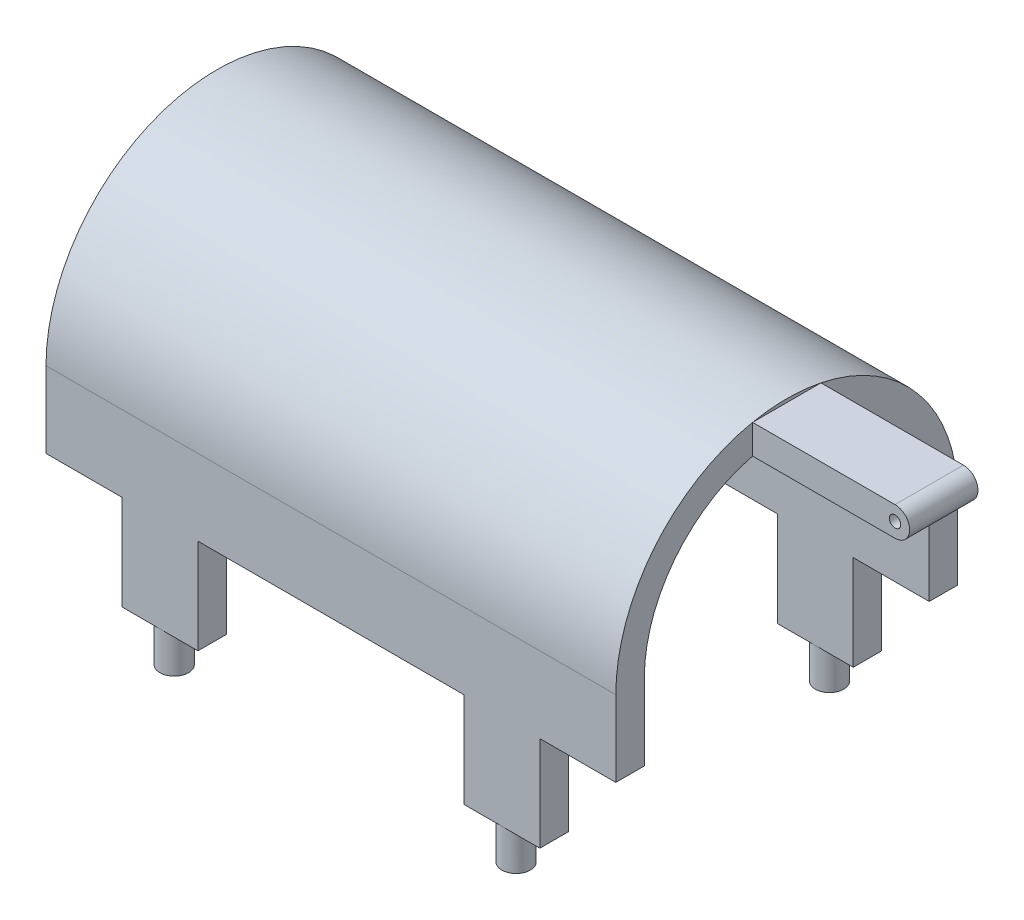
ISO-10303-21;
HEADER;
FILE_DESCRIPTION(('STEP AP214'),'2;1');
FILE_NAME('part.step','',(''),(''),'','','');
FILE_SCHEMA(('AUTOMOTIVE_DESIGN { 1 0 10303 214 1 1 1 1 }'));
ENDSEC;
DATA;
#1=APPLICATION_CONTEXT('core data for automotive mechanical design processes');
#2=APPLICATION_PROTOCOL_DEFINITION('international standard','automotive_design',2000,#1);
#3=PRODUCT_CONTEXT('',#1,'mechanical');
#4=PRODUCT('Part','Part','',(#3));
#5=PRODUCT_RELATED_PRODUCT_CATEGORY('part','',(#4));
#6=PRODUCT_DEFINITION_FORMATION('','',#4);
#7=PRODUCT_DEFINITION_CONTEXT('part definition',#1,'design');
#8=PRODUCT_DEFINITION('design','',#6,#7);
#9=PRODUCT_DEFINITION_SHAPE('','',#8);
#10=(LENGTH_UNIT() NAMED_UNIT(*) SI_UNIT(.MILLI.,.METRE.));
#11=(NAMED_UNIT(*) PLANE_ANGLE_UNIT() SI_UNIT($,.RADIAN.));
#12=(NAMED_UNIT(*) SI_UNIT($,.STERADIAN.) SOLID_ANGLE_UNIT());
#13=UNCERTAINTY_MEASURE_WITH_UNIT(LENGTH_MEASURE(1.E-05),#10,'distance_accuracy_value','');
#14=(GEOMETRIC_REPRESENTATION_CONTEXT(3) GLOBAL_UNCERTAINTY_ASSIGNED_CONTEXT((#13)) GLOBAL_UNIT_ASSIGNED_CONTEXT((#10,
#11,#12)) REPRESENTATION_CONTEXT('',''));
#15=CARTESIAN_POINT('',(0.,0.,0.));
#16=DIRECTION('',(0.,0.,1.));
#17=DIRECTION('',(1.,0.,0.));
#18=AXIS2_PLACEMENT_3D('',#15,#16,#17);
#19=CARTESIAN_POINT('',(19.05,-11.43,-9.525));
#20=DIRECTION('',(0.,1.,0.));
#21=DIRECTION('',(0.,0.,1.));
#22=AXIS2_PLACEMENT_3D('',#19,#20,#21);
#23=PLANE('',#22);
#24=CARTESIAN_POINT('',(-11.43,-11.43,-10.4775));
#25=DIRECTION('',(0.,-1.,0.));
#26=DIRECTION('',(0.,0.,1.));
#27=AXIS2_PLACEMENT_3D('',#24,#25,#26);
#28=CIRCLE('',#27,0.952499999999997);
#29=CARTESIAN_POINT('',(-11.43,-11.43,-9.52500000000001));
#30=VERTEX_POINT('',#29);
#31=CARTESIAN_POINT('',(-11.43,-11.43,-11.43));
#32=VERTEX_POINT('',#31);
#33=EDGE_CURVE('E270',#30,#32,#28,.T.);
#34=ORIENTED_EDGE('',*,*,#33,.F.);
#35=DIRECTION('',(-1.,0.,0.));
#36=VECTOR('',#35,1.);
#37=CARTESIAN_POINT('',(19.05,-11.43,-9.525));
#38=LINE('',#37,#36);
#39=CARTESIAN_POINT('',(-13.97,-11.43,-9.525));
#40=VERTEX_POINT('',#39);
#41=EDGE_CURVE('E256',#30,#40,#38,.T.);
#42=ORIENTED_EDGE('',*,*,#41,.T.);
#43=DIRECTION('',(0.,0.,-1.));
#44=VECTOR('',#43,1.);
#45=CARTESIAN_POINT('',(-13.97,-11.43,11.43));
#46=LINE('',#45,#44);
#47=CARTESIAN_POINT('',(-13.97,-11.43,-11.43));
#48=VERTEX_POINT('',#47);
#49=EDGE_CURVE('E369',#40,#48,#46,.T.);
#50=ORIENTED_EDGE('',*,*,#49,.T.);
#51=DIRECTION('',(-1.,0.,0.));
#52=VECTOR('',#51,1.);
#53=CARTESIAN_POINT('',(19.05,-11.43,-11.43));
#54=LINE('',#53,#52);
#55=EDGE_CURVE('E271',#32,#48,#54,.T.);
#56=ORIENTED_EDGE('',*,*,#55,.F.);
#57=EDGE_LOOP('',(#34,#42,#50,#56));
#58=FACE_BOUND('',#57,.T.);
#59=ADVANCED_FACE('F33',(#58),#23,.F.);
#60=CARTESIAN_POINT('',(19.05,-11.43,9.525));
#61=DIRECTION('',(0.,1.,0.));
#62=DIRECTION('',(0.,0.,1.));
#63=AXIS2_PLACEMENT_3D('',#60,#61,#62);
#64=PLANE('',#63);
#65=CARTESIAN_POINT('',(-11.43,-11.43,10.4775));
#66=DIRECTION('',(0.,-1.,0.));
#67=DIRECTION('',(0.,0.,-1.));
#68=AXIS2_PLACEMENT_3D('',#65,#66,#67);
#69=CIRCLE('',#68,0.952499999999997);
#70=CARTESIAN_POINT('',(-11.43,-11.43,11.43));
#71=VERTEX_POINT('',#70);
#72=CARTESIAN_POINT('',(-11.43,-11.43,9.525));
#73=VERTEX_POINT('',#72);
#74=EDGE_CURVE('E284',#71,#73,#69,.T.);
#75=ORIENTED_EDGE('',*,*,#74,.F.);
#76=DIRECTION('',(-1.,0.,0.));
#77=VECTOR('',#76,1.);
#78=CARTESIAN_POINT('',(19.05,-11.43,11.43));
#79=LINE('',#78,#77);
#80=CARTESIAN_POINT('',(-13.97,-11.43,11.43));
#81=VERTEX_POINT('',#80);
#82=EDGE_CURVE('E475',#71,#81,#79,.T.);
#83=ORIENTED_EDGE('',*,*,#82,.T.);
#84=CARTESIAN_POINT('',(-13.97,-11.43,9.525));
#85=VERTEX_POINT('',#84);
#86=EDGE_CURVE('E338',#81,#85,#46,.T.);
#87=ORIENTED_EDGE('',*,*,#86,.T.);
#88=DIRECTION('',(-1.,0.,0.));
#89=VECTOR('',#88,1.);
#90=CARTESIAN_POINT('',(19.05,-11.43,9.525));
#91=LINE('',#90,#89);
#92=EDGE_CURVE('E466',#73,#85,#91,.T.);
#93=ORIENTED_EDGE('',*,*,#92,.F.);
#94=EDGE_LOOP('',(#75,#83,#87,#93));
#95=FACE_BOUND('',#94,.T.);
#96=ADVANCED_FACE('F534',(#95),#64,.F.);
#97=CARTESIAN_POINT('',(11.43,-11.43,10.4775));
#98=DIRECTION('',(0.,-1.,0.));
#99=DIRECTION('',(0.,0.,1.));
#100=AXIS2_PLACEMENT_3D('',#97,#98,#99);
#101=CIRCLE('',#100,0.952499999999997);
#102=CARTESIAN_POINT('',(11.43,-11.43,11.43));
#103=VERTEX_POINT('',#102);
#104=CARTESIAN_POINT('',(11.43,-11.43,9.525));
#105=VERTEX_POINT('',#104);
#106=EDGE_CURVE('E289',#103,#105,#101,.T.);
#107=ORIENTED_EDGE('',*,*,#106,.F.);
#108=CARTESIAN_POINT('',(8.89,-11.43,11.43));
#109=VERTEX_POINT('',#108);
#110=EDGE_CURVE('E474',#103,#109,#79,.T.);
#111=ORIENTED_EDGE('',*,*,#110,.T.);
#112=DIRECTION('',(0.,0.,-1.));
#113=VECTOR('',#112,1.);
#114=CARTESIAN_POINT('',(8.89,-11.43,11.43));
#115=LINE('',#114,#113);
#116=CARTESIAN_POINT('',(8.89,-11.43,9.525));
#117=VERTEX_POINT('',#116);
#118=EDGE_CURVE('E352',#109,#117,#115,.T.);
#119=ORIENTED_EDGE('',*,*,#118,.T.);
#120=EDGE_CURVE('E470',#105,#117,#91,.T.);
#121=ORIENTED_EDGE('',*,*,#120,.F.);
#122=EDGE_LOOP('',(#107,#111,#119,#121));
#123=FACE_BOUND('',#122,.T.);
#124=ADVANCED_FACE('F588',(#123),#64,.F.);
#125=CARTESIAN_POINT('',(11.43,-11.43,-10.4775));
#126=DIRECTION('',(0.,-1.,0.));
#127=DIRECTION('',(0.,0.,-1.));
#128=AXIS2_PLACEMENT_3D('',#125,#126,#127);
#129=CIRCLE('',#128,0.952499999999997);
#130=CARTESIAN_POINT('',(11.43,-11.43,-9.525));
#131=VERTEX_POINT('',#130);
#132=CARTESIAN_POINT('',(11.43,-11.43,-11.43));
#133=VERTEX_POINT('',#132);
#134=EDGE_CURVE('E288',#131,#133,#129,.T.);
#135=ORIENTED_EDGE('',*,*,#134,.F.);
#136=CARTESIAN_POINT('',(8.89,-11.43,-9.525));
#137=VERTEX_POINT('',#136);
#138=EDGE_CURVE('E255',#131,#137,#38,.T.);
#139=ORIENTED_EDGE('',*,*,#138,.T.);
#140=CARTESIAN_POINT('',(8.89,-11.43,-11.43));
#141=VERTEX_POINT('',#140);
#142=EDGE_CURVE('E333',#137,#141,#115,.T.);
#143=ORIENTED_EDGE('',*,*,#142,.T.);
#144=EDGE_CURVE('E484',#133,#141,#54,.T.);
#145=ORIENTED_EDGE('',*,*,#144,.F.);
#146=EDGE_LOOP('',(#135,#139,#143,#145));
#147=FACE_BOUND('',#146,.T.);
#148=ADVANCED_FACE('F584',(#147),#23,.F.);
#149=EDGE_CURVE('E296',#133,#131,#129,.T.);
#150=ORIENTED_EDGE('',*,*,#149,.F.);
#151=CARTESIAN_POINT('',(13.97,-11.43,-11.43));
#152=VERTEX_POINT('',#151);
#153=EDGE_CURVE('E268',#152,#133,#54,.T.);
#154=ORIENTED_EDGE('',*,*,#153,.F.);
#155=DIRECTION('',(0.,0.,-1.));
#156=VECTOR('',#155,1.);
#157=CARTESIAN_POINT('',(13.97,-11.43,11.43));
#158=LINE('',#157,#156);
#159=CARTESIAN_POINT('',(13.97,-11.43,-9.525));
#160=VERTEX_POINT('',#159);
#161=EDGE_CURVE('E306',#160,#152,#158,.T.);
#162=ORIENTED_EDGE('',*,*,#161,.F.);
#163=EDGE_CURVE('E258',#160,#131,#38,.T.);
#164=ORIENTED_EDGE('',*,*,#163,.T.);
#165=EDGE_LOOP('',(#150,#154,#162,#164));
#166=FACE_BOUND('',#165,.T.);
#167=ADVANCED_FACE('F593',(#166),#23,.F.);
#168=EDGE_CURVE('E282',#105,#103,#101,.T.);
#169=ORIENTED_EDGE('',*,*,#168,.F.);
#170=CARTESIAN_POINT('',(13.97,-11.43,9.525));
#171=VERTEX_POINT('',#170);
#172=EDGE_CURVE('E471',#171,#105,#91,.T.);
#173=ORIENTED_EDGE('',*,*,#172,.F.);
#174=CARTESIAN_POINT('',(13.97,-11.43,11.43));
#175=VERTEX_POINT('',#174);
#176=EDGE_CURVE('E321',#175,#171,#158,.T.);
#177=ORIENTED_EDGE('',*,*,#176,.F.);
#178=EDGE_CURVE('E476',#175,#103,#79,.T.);
#179=ORIENTED_EDGE('',*,*,#178,.T.);
#180=EDGE_LOOP('',(#169,#173,#177,#179));
#181=FACE_BOUND('',#180,.T.);
#182=ADVANCED_FACE('F521',(#181),#64,.F.);
#183=CARTESIAN_POINT('',(19.05,0.,0.));
#184=DIRECTION('',(-1.,0.,0.));
#185=DIRECTION('',(0.,0.,1.));
#186=AXIS2_PLACEMENT_3D('',#183,#184,#185);
#187=CYLINDRICAL_SURFACE('',#186,9.525);
#188=DIRECTION('',(-1.,0.,0.));
#189=VECTOR('',#188,1.);
#190=CARTESIAN_POINT('',(28.575,9.24661175782784,2.286));
#191=LINE('',#190,#189);
#192=CARTESIAN_POINT('',(19.05,9.24661175782784,2.286));
#193=VERTEX_POINT('',#192);
#194=CARTESIAN_POINT('',(9.525,9.24661175782784,2.286));
#195=VERTEX_POINT('',#194);
#196=EDGE_CURVE('E423',#193,#195,#191,.T.);
#197=ORIENTED_EDGE('',*,*,#196,.F.);
#198=CARTESIAN_POINT('',(19.05,0.,0.));
#199=DIRECTION('',(-1.,0.,0.));
#200=DIRECTION('',(0.,0.,-1.));
#201=AXIS2_PLACEMENT_3D('',#198,#199,#200);
#202=CIRCLE('',#201,9.525);
#203=CARTESIAN_POINT('',(19.05,0.,9.525));
#204=VERTEX_POINT('',#203);
#205=EDGE_CURVE('E430',#204,#193,#202,.T.);
#206=ORIENTED_EDGE('',*,*,#205,.F.);
#207=DIRECTION('',(-1.,0.,0.));
#208=VECTOR('',#207,1.);
#209=CARTESIAN_POINT('',(19.05,0.,9.525));
#210=LINE('',#209,#208);
#211=CARTESIAN_POINT('',(-19.05,0.,9.525));
#212=VERTEX_POINT('',#211);
#213=EDGE_CURVE('E449',#204,#212,#210,.T.);
#214=ORIENTED_EDGE('',*,*,#213,.T.);
#215=CARTESIAN_POINT('',(-19.05,0.,0.));
#216=DIRECTION('',(-1.,0.,0.));
#217=DIRECTION('',(0.,0.,-1.));
#218=AXIS2_PLACEMENT_3D('',#215,#216,#217);
#219=CIRCLE('',#218,9.525);
#220=CARTESIAN_POINT('',(-19.05,0.,-9.525));
#221=VERTEX_POINT('',#220);
#222=EDGE_CURVE('E429',#212,#221,#219,.T.);
#223=ORIENTED_EDGE('',*,*,#222,.T.);
#224=DIRECTION('',(-1.,0.,0.));
#225=VECTOR('',#224,1.);
#226=CARTESIAN_POINT('',(19.05,0.,-9.525));
#227=LINE('',#226,#225);
#228=CARTESIAN_POINT('',(19.05,0.,-9.525));
#229=VERTEX_POINT('',#228);
#230=EDGE_CURVE('E486',#229,#221,#227,.T.);
#231=ORIENTED_EDGE('',*,*,#230,.F.);
#232=CARTESIAN_POINT('',(19.05,9.24661175782784,-2.286));
#233=VERTEX_POINT('',#232);
#234=EDGE_CURVE('E434',#233,#229,#202,.T.);
#235=ORIENTED_EDGE('',*,*,#234,.F.);
#236=DIRECTION('',(-1.,0.,0.));
#237=VECTOR('',#236,1.);
#238=CARTESIAN_POINT('',(28.575,9.24661175782784,-2.286));
#239=LINE('',#238,#237);
#240=CARTESIAN_POINT('',(9.525,9.24661175782784,-2.286));
#241=VERTEX_POINT('',#240);
#242=EDGE_CURVE('E419',#233,#241,#239,.T.);
#243=ORIENTED_EDGE('',*,*,#242,.T.);
#244=CARTESIAN_POINT('',(9.525,0.,0.));
#245=DIRECTION('',(1.,0.,0.));
#246=DIRECTION('',(0.,0.,-1.));
#247=AXIS2_PLACEMENT_3D('',#244,#245,#246);
#248=CIRCLE('',#247,9.525);
#249=EDGE_CURVE('E427',#195,#241,#248,.F.);
#250=ORIENTED_EDGE('',*,*,#249,.F.);
#251=EDGE_LOOP('',(#197,#206,#214,#223,#231,#235,#243,#250));
#252=FACE_BOUND('',#251,.T.);
#253=ADVANCED_FACE('F35',(#252),#187,.F.);
#254=CARTESIAN_POINT('',(19.05,0.,0.));
#255=DIRECTION('',(1.,0.,0.));
#256=DIRECTION('',(0.,0.,-1.));
#257=AXIS2_PLACEMENT_3D('',#254,#255,#256);
#258=PLANE('',#257);
#259=DIRECTION('',(0.,0.,-1.));
#260=VECTOR('',#259,1.);
#261=CARTESIAN_POINT('',(19.05,-5.08,11.43));
#262=LINE('',#261,#260);
#263=CARTESIAN_POINT('',(19.05,-5.08,11.43));
#264=VERTEX_POINT('',#263);
#265=CARTESIAN_POINT('',(19.05,-5.08,9.525));
#266=VERTEX_POINT('',#265);
#267=EDGE_CURVE('E312',#264,#266,#262,.T.);
#268=ORIENTED_EDGE('',*,*,#267,.T.);
#269=DIRECTION('',(0.,1.,0.));
#270=VECTOR('',#269,1.);
#271=CARTESIAN_POINT('',(19.05,0.,9.525));
#272=LINE('',#271,#270);
#273=EDGE_CURVE('E447',#266,#204,#272,.T.);
#274=ORIENTED_EDGE('',*,*,#273,.T.);
#275=ORIENTED_EDGE('',*,*,#205,.T.);
#276=DIRECTION('',(0.,1.,0.));
#277=VECTOR('',#276,1.);
#278=CARTESIAN_POINT('',(19.05,0.,2.286));
#279=LINE('',#278,#277);
#280=CARTESIAN_POINT('',(19.05,11.1990671040047,2.286));
#281=VERTEX_POINT('',#280);
#282=EDGE_CURVE('E495',#193,#281,#279,.T.);
#283=ORIENTED_EDGE('',*,*,#282,.T.);
#284=CARTESIAN_POINT('',(19.05,0.,0.));
#285=DIRECTION('',(1.,0.,0.));
#286=DIRECTION('',(0.,0.,-1.));
#287=AXIS2_PLACEMENT_3D('',#284,#285,#286);
#288=CIRCLE('',#287,11.43);
#289=CARTESIAN_POINT('',(19.05,0.,11.43));
#290=VERTEX_POINT('',#289);
#291=EDGE_CURVE('E439',#281,#290,#288,.T.);
#292=ORIENTED_EDGE('',*,*,#291,.T.);
#293=DIRECTION('',(0.,-1.,0.));
#294=VECTOR('',#293,1.);
#295=CARTESIAN_POINT('',(19.05,0.,11.43));
#296=LINE('',#295,#294);
#297=EDGE_CURVE('E443',#290,#264,#296,.T.);
#298=ORIENTED_EDGE('',*,*,#297,.T.);
#299=EDGE_LOOP('',(#268,#274,#275,#283,#292,#298));
#300=FACE_BOUND('',#299,.T.);
#301=ADVANCED_FACE('F556',(#300),#258,.T.);
#302=CARTESIAN_POINT('',(19.05,-5.08,-9.525));
#303=VERTEX_POINT('',#302);
#304=CARTESIAN_POINT('',(19.05,-5.08,-11.43));
#305=VERTEX_POINT('',#304);
#306=EDGE_CURVE('E316',#303,#305,#262,.T.);
#307=ORIENTED_EDGE('',*,*,#306,.T.);
#308=DIRECTION('',(0.,1.,0.));
#309=VECTOR('',#308,1.);
#310=CARTESIAN_POINT('',(19.05,0.,-11.43));
#311=LINE('',#310,#309);
#312=CARTESIAN_POINT('',(19.05,0.,-11.43));
#313=VERTEX_POINT('',#312);
#314=EDGE_CURVE('E437',#305,#313,#311,.T.);
#315=ORIENTED_EDGE('',*,*,#314,.T.);
#316=CARTESIAN_POINT('',(19.05,11.1990671040047,-2.286));
#317=VERTEX_POINT('',#316);
#318=EDGE_CURVE('E440',#313,#317,#288,.T.);
#319=ORIENTED_EDGE('',*,*,#318,.T.);
#320=DIRECTION('',(0.,-1.,0.));
#321=VECTOR('',#320,1.);
#322=CARTESIAN_POINT('',(19.05,0.,-2.286));
#323=LINE('',#322,#321);
#324=EDGE_CURVE('E492',#317,#233,#323,.T.);
#325=ORIENTED_EDGE('',*,*,#324,.T.);
#326=ORIENTED_EDGE('',*,*,#234,.T.);
#327=DIRECTION('',(0.,-1.,0.));
#328=VECTOR('',#327,1.);
#329=CARTESIAN_POINT('',(19.05,0.,-9.525));
#330=LINE('',#329,#328);
#331=EDGE_CURVE('E433',#229,#303,#330,.T.);
#332=ORIENTED_EDGE('',*,*,#331,.T.);
#333=EDGE_LOOP('',(#307,#315,#319,#325,#326,#332));
#334=FACE_BOUND('',#333,.T.);
#335=ADVANCED_FACE('F651',(#334),#258,.T.);
#336=EDGE_CURVE('E444',#317,#281,#288,.T.);
#337=ORIENTED_EDGE('',*,*,#336,.T.);
#338=DIRECTION('',(0.,0.,-1.));
#339=VECTOR('',#338,1.);
#340=CARTESIAN_POINT('',(19.05,11.1990671040047,0.));
#341=LINE('',#340,#339);
#342=EDGE_CURVE('E489',#281,#317,#341,.T.);
#343=ORIENTED_EDGE('',*,*,#342,.T.);
#344=EDGE_LOOP('',(#337,#343));
#345=FACE_BOUND('',#344,.T.);
#346=ADVANCED_FACE('F603',(#345),#258,.T.);
#347=CARTESIAN_POINT('',(19.05,0.,-9.525));
#348=DIRECTION('',(0.,0.,-1.));
#349=DIRECTION('',(0.,1.,0.));
#350=AXIS2_PLACEMENT_3D('',#347,#348,#349);
#351=PLANE('',#350);
#352=DIRECTION('',(0.,1.,0.));
#353=VECTOR('',#352,1.);
#354=CARTESIAN_POINT('',(13.97,0.,-9.525));
#355=LINE('',#354,#353);
#356=CARTESIAN_POINT('',(13.97,-5.08,-9.525));
#357=VERTEX_POINT('',#356);
#358=EDGE_CURVE('E388',#160,#357,#355,.T.);
#359=ORIENTED_EDGE('',*,*,#358,.T.);
#360=DIRECTION('',(1.,0.,0.));
#361=VECTOR('',#360,1.);
#362=CARTESIAN_POINT('',(19.05,-5.08,-9.525));
#363=LINE('',#362,#361);
#364=EDGE_CURVE('E390',#357,#303,#363,.T.);
#365=ORIENTED_EDGE('',*,*,#364,.T.);
#366=ORIENTED_EDGE('',*,*,#331,.F.);
#367=ORIENTED_EDGE('',*,*,#230,.T.);
#368=DIRECTION('',(0.,-1.,0.));
#369=VECTOR('',#368,1.);
#370=CARTESIAN_POINT('',(-19.05,0.,-9.525));
#371=LINE('',#370,#369);
#372=CARTESIAN_POINT('',(-19.05,-5.08,-9.525));
#373=VERTEX_POINT('',#372);
#374=EDGE_CURVE('E452',#221,#373,#371,.T.);
#375=ORIENTED_EDGE('',*,*,#374,.T.);
#376=DIRECTION('',(1.,0.,0.));
#377=VECTOR('',#376,1.);
#378=CARTESIAN_POINT('',(19.05,-5.08000000000001,-9.525));
#379=LINE('',#378,#377);
#380=CARTESIAN_POINT('',(-13.97,-5.08,-9.525));
#381=VERTEX_POINT('',#380);
#382=EDGE_CURVE('E377',#373,#381,#379,.T.);
#383=ORIENTED_EDGE('',*,*,#382,.T.);
#384=DIRECTION('',(0.,-1.,0.));
#385=VECTOR('',#384,1.);
#386=CARTESIAN_POINT('',(-13.97,0.,-9.525));
#387=LINE('',#386,#385);
#388=EDGE_CURVE('E264',#381,#40,#387,.T.);
#389=ORIENTED_EDGE('',*,*,#388,.T.);
#390=ORIENTED_EDGE('',*,*,#41,.F.);
#391=CARTESIAN_POINT('',(-8.89,-11.43,-9.525));
#392=VERTEX_POINT('',#391);
#393=EDGE_CURVE('E249',#392,#30,#38,.T.);
#394=ORIENTED_EDGE('',*,*,#393,.F.);
#395=DIRECTION('',(0.,1.,0.));
#396=VECTOR('',#395,1.);
#397=CARTESIAN_POINT('',(-8.89,0.,-9.525));
#398=LINE('',#397,#396);
#399=CARTESIAN_POINT('',(-8.89,-5.08,-9.525));
#400=VERTEX_POINT('',#399);
#401=EDGE_CURVE('E380',#392,#400,#398,.T.);
#402=ORIENTED_EDGE('',*,*,#401,.T.);
#403=DIRECTION('',(1.,0.,0.));
#404=VECTOR('',#403,1.);
#405=CARTESIAN_POINT('',(19.05,-5.08,-9.525));
#406=LINE('',#405,#404);
#407=CARTESIAN_POINT('',(8.89,-5.08,-9.525));
#408=VERTEX_POINT('',#407);
#409=EDGE_CURVE('E382',#400,#408,#406,.T.);
#410=ORIENTED_EDGE('',*,*,#409,.T.);
#411=DIRECTION('',(0.,-1.,0.));
#412=VECTOR('',#411,1.);
#413=CARTESIAN_POINT('',(8.89,0.,-9.525));
#414=LINE('',#413,#412);
#415=EDGE_CURVE('E385',#408,#137,#414,.T.);
#416=ORIENTED_EDGE('',*,*,#415,.T.);
#417=ORIENTED_EDGE('',*,*,#138,.F.);
#418=ORIENTED_EDGE('',*,*,#163,.F.);
#419=EDGE_LOOP('',(#359,#365,#366,#367,#375,#383,#389,#390,#394,#402,#410,#416,#417,#418));
#420=FACE_BOUND('',#419,.T.);
#421=ADVANCED_FACE('F262',(#420),#351,.F.);
#422=EDGE_CURVE('E48',#32,#30,#28,.T.);
#423=ORIENTED_EDGE('',*,*,#422,.F.);
#424=CARTESIAN_POINT('',(-8.88999999999999,-11.43,-11.43));
#425=VERTEX_POINT('',#424);
#426=EDGE_CURVE('E483',#425,#32,#54,.T.);
#427=ORIENTED_EDGE('',*,*,#426,.F.);
#428=DIRECTION('',(0.,0.,-1.));
#429=VECTOR('',#428,1.);
#430=CARTESIAN_POINT('',(-8.89,-11.43,11.43));
#431=LINE('',#430,#429);
#432=EDGE_CURVE('E252',#392,#425,#431,.T.);
#433=ORIENTED_EDGE('',*,*,#432,.F.);
#434=ORIENTED_EDGE('',*,*,#393,.T.);
#435=EDGE_LOOP('',(#423,#427,#433,#434));
#436=FACE_BOUND('',#435,.T.);
#437=ADVANCED_FACE('F251',(#436),#23,.F.);
#438=CARTESIAN_POINT('',(19.05,0.,-11.43));
#439=DIRECTION('',(0.,0.,1.));
#440=DIRECTION('',(0.,-1.,0.));
#441=AXIS2_PLACEMENT_3D('',#438,#439,#440);
#442=PLANE('',#441);
#443=ORIENTED_EDGE('',*,*,#314,.F.);
#444=DIRECTION('',(1.,0.,0.));
#445=VECTOR('',#444,1.);
#446=CARTESIAN_POINT('',(19.05,-5.08,-11.43));
#447=LINE('',#446,#445);
#448=CARTESIAN_POINT('',(13.97,-5.08,-11.43));
#449=VERTEX_POINT('',#448);
#450=EDGE_CURVE('E303',#449,#305,#447,.T.);
#451=ORIENTED_EDGE('',*,*,#450,.F.);
#452=DIRECTION('',(0.,1.,0.));
#453=VECTOR('',#452,1.);
#454=CARTESIAN_POINT('',(13.97,-11.43,-11.43));
#455=LINE('',#454,#453);
#456=EDGE_CURVE('E307',#152,#449,#455,.T.);
#457=ORIENTED_EDGE('',*,*,#456,.F.);
#458=ORIENTED_EDGE('',*,*,#153,.T.);
#459=ORIENTED_EDGE('',*,*,#144,.T.);
#460=DIRECTION('',(0.,-1.,0.));
#461=VECTOR('',#460,1.);
#462=CARTESIAN_POINT('',(8.89,-11.43,-11.43));
#463=LINE('',#462,#461);
#464=CARTESIAN_POINT('',(8.89,-5.08,-11.43));
#465=VERTEX_POINT('',#464);
#466=EDGE_CURVE('E334',#465,#141,#463,.T.);
#467=ORIENTED_EDGE('',*,*,#466,.F.);
#468=DIRECTION('',(1.,0.,0.));
#469=VECTOR('',#468,1.);
#470=CARTESIAN_POINT('',(8.89,-5.08,-11.43));
#471=LINE('',#470,#469);
#472=CARTESIAN_POINT('',(-8.89,-5.08,-11.43));
#473=VERTEX_POINT('',#472);
#474=EDGE_CURVE('E327',#473,#465,#471,.T.);
#475=ORIENTED_EDGE('',*,*,#474,.F.);
#476=DIRECTION('',(0.,1.,0.));
#477=VECTOR('',#476,1.);
#478=CARTESIAN_POINT('',(-8.89,-11.43,-11.43));
#479=LINE('',#478,#477);
#480=EDGE_CURVE('E337',#425,#473,#479,.T.);
#481=ORIENTED_EDGE('',*,*,#480,.F.);
#482=ORIENTED_EDGE('',*,*,#426,.T.);
#483=ORIENTED_EDGE('',*,*,#55,.T.);
#484=DIRECTION('',(0.,-1.,0.));
#485=VECTOR('',#484,1.);
#486=CARTESIAN_POINT('',(-13.97,-11.43,-11.43));
#487=LINE('',#486,#485);
#488=CARTESIAN_POINT('',(-13.97,-5.08,-11.43));
#489=VERTEX_POINT('',#488);
#490=EDGE_CURVE('E359',#489,#48,#487,.T.);
#491=ORIENTED_EDGE('',*,*,#490,.F.);
#492=DIRECTION('',(1.,0.,0.));
#493=VECTOR('',#492,1.);
#494=CARTESIAN_POINT('',(-19.05,-5.08,-11.43));
#495=LINE('',#494,#493);
#496=CARTESIAN_POINT('',(-19.05,-5.08,-11.43));
#497=VERTEX_POINT('',#496);
#498=EDGE_CURVE('E295',#497,#489,#495,.T.);
#499=ORIENTED_EDGE('',*,*,#498,.F.);
#500=DIRECTION('',(0.,1.,0.));
#501=VECTOR('',#500,1.);
#502=CARTESIAN_POINT('',(-19.05,0.,-11.43));
#503=LINE('',#502,#501);
#504=CARTESIAN_POINT('',(-19.05,0.,-11.43));
#505=VERTEX_POINT('',#504);
#506=EDGE_CURVE('E455',#497,#505,#503,.T.);
#507=ORIENTED_EDGE('',*,*,#506,.T.);
#508=DIRECTION('',(-1.,0.,0.));
#509=VECTOR('',#508,1.);
#510=CARTESIAN_POINT('',(19.05,0.,-11.43));
#511=LINE('',#510,#509);
#512=EDGE_CURVE('E480',#313,#505,#511,.T.);
#513=ORIENTED_EDGE('',*,*,#512,.F.);
#514=EDGE_LOOP('',(#443,#451,#457,#458,#459,#467,#475,#481,#482,#483,#491,#499,#507,#513));
#515=FACE_BOUND('',#514,.T.);
#516=ADVANCED_FACE('F596',(#515),#442,.F.);
#517=CARTESIAN_POINT('',(19.05,0.,0.));
#518=DIRECTION('',(-1.,0.,0.));
#519=DIRECTION('',(0.,0.,1.));
#520=AXIS2_PLACEMENT_3D('',#517,#518,#519);
#521=CYLINDRICAL_SURFACE('',#520,11.43);
#522=ORIENTED_EDGE('',*,*,#336,.F.);
#523=ORIENTED_EDGE('',*,*,#318,.F.);
#524=ORIENTED_EDGE('',*,*,#512,.T.);
#525=CARTESIAN_POINT('',(-19.05,0.,0.));
#526=DIRECTION('',(1.,0.,0.));
#527=DIRECTION('',(0.,0.,-1.));
#528=AXIS2_PLACEMENT_3D('',#525,#526,#527);
#529=CIRCLE('',#528,11.43);
#530=CARTESIAN_POINT('',(-19.05,0.,11.43));
#531=VERTEX_POINT('',#530);
#532=EDGE_CURVE('E457',#505,#531,#529,.T.);
#533=ORIENTED_EDGE('',*,*,#532,.T.);
#534=DIRECTION('',(-1.,0.,0.));
#535=VECTOR('',#534,1.);
#536=CARTESIAN_POINT('',(19.05,0.,11.43));
#537=LINE('',#536,#535);
#538=EDGE_CURVE('E477',#290,#531,#537,.T.);
#539=ORIENTED_EDGE('',*,*,#538,.F.);
#540=ORIENTED_EDGE('',*,*,#291,.F.);
#541=EDGE_LOOP('',(#522,#523,#524,#533,#539,#540));
#542=FACE_BOUND('',#541,.T.);
#543=ADVANCED_FACE('F601',(#542),#521,.T.);
#544=CARTESIAN_POINT('',(19.05,0.,11.43));
#545=DIRECTION('',(0.,0.,-1.));
#546=DIRECTION('',(0.,1.,0.));
#547=AXIS2_PLACEMENT_3D('',#544,#545,#546);
#548=PLANE('',#547);
#549=DIRECTION('',(0.,1.,0.));
#550=VECTOR('',#549,1.);
#551=CARTESIAN_POINT('',(13.97,-11.43,11.43));
#552=LINE('',#551,#550);
#553=CARTESIAN_POINT('',(13.97,-5.08,11.43));
#554=VERTEX_POINT('',#553);
#555=EDGE_CURVE('E299',#175,#554,#552,.T.);
#556=ORIENTED_EDGE('',*,*,#555,.T.);
#557=DIRECTION('',(1.,0.,0.));
#558=VECTOR('',#557,1.);
#559=CARTESIAN_POINT('',(19.05,-5.08,11.43));
#560=LINE('',#559,#558);
#561=EDGE_CURVE('E302',#554,#264,#560,.T.);
#562=ORIENTED_EDGE('',*,*,#561,.T.);
#563=ORIENTED_EDGE('',*,*,#297,.F.);
#564=ORIENTED_EDGE('',*,*,#538,.T.);
#565=DIRECTION('',(0.,-1.,0.));
#566=VECTOR('',#565,1.);
#567=CARTESIAN_POINT('',(-19.05,0.,11.43));
#568=LINE('',#567,#566);
#569=CARTESIAN_POINT('',(-19.05,-5.08,11.43));
#570=VERTEX_POINT('',#569);
#571=EDGE_CURVE('E459',#531,#570,#568,.T.);
#572=ORIENTED_EDGE('',*,*,#571,.T.);
#573=DIRECTION('',(1.,0.,0.));
#574=VECTOR('',#573,1.);
#575=CARTESIAN_POINT('',(-19.05,-5.08,11.43));
#576=LINE('',#575,#574);
#577=CARTESIAN_POINT('',(-13.97,-5.08,11.43));
#578=VERTEX_POINT('',#577);
#579=EDGE_CURVE('E355',#570,#578,#576,.T.);
#580=ORIENTED_EDGE('',*,*,#579,.T.);
#581=DIRECTION('',(0.,-1.,0.));
#582=VECTOR('',#581,1.);
#583=CARTESIAN_POINT('',(-13.97,-11.43,11.43));
#584=LINE('',#583,#582);
#585=EDGE_CURVE('E358',#578,#81,#584,.T.);
#586=ORIENTED_EDGE('',*,*,#585,.T.);
#587=ORIENTED_EDGE('',*,*,#82,.F.);
#588=CARTESIAN_POINT('',(-8.89,-11.43,11.43));
#589=VERTEX_POINT('',#588);
#590=EDGE_CURVE('E472',#589,#71,#79,.T.);
#591=ORIENTED_EDGE('',*,*,#590,.F.);
#592=DIRECTION('',(0.,1.,0.));
#593=VECTOR('',#592,1.);
#594=CARTESIAN_POINT('',(-8.89,-11.43,11.43));
#595=LINE('',#594,#593);
#596=CARTESIAN_POINT('',(-8.89,-5.08,11.43));
#597=VERTEX_POINT('',#596);
#598=EDGE_CURVE('E326',#589,#597,#595,.T.);
#599=ORIENTED_EDGE('',*,*,#598,.T.);
#600=DIRECTION('',(1.,0.,0.));
#601=VECTOR('',#600,1.);
#602=CARTESIAN_POINT('',(8.89,-5.08,11.43));
#603=LINE('',#602,#601);
#604=CARTESIAN_POINT('',(8.89,-5.08,11.43));
#605=VERTEX_POINT('',#604);
#606=EDGE_CURVE('E330',#597,#605,#603,.T.);
#607=ORIENTED_EDGE('',*,*,#606,.T.);
#608=DIRECTION('',(0.,-1.,0.));
#609=VECTOR('',#608,1.);
#610=CARTESIAN_POINT('',(8.89,-11.43,11.43));
#611=LINE('',#610,#609);
#612=EDGE_CURVE('E323',#605,#109,#611,.T.);
#613=ORIENTED_EDGE('',*,*,#612,.T.);
#614=ORIENTED_EDGE('',*,*,#110,.F.);
#615=ORIENTED_EDGE('',*,*,#178,.F.);
#616=EDGE_LOOP('',(#556,#562,#563,#564,#572,#580,#586,#587,#591,#599,#607,#613,#614,#615));
#617=FACE_BOUND('',#616,.T.);
#618=ADVANCED_FACE('F538',(#617),#548,.F.);
#619=EDGE_CURVE('E56',#73,#71,#69,.T.);
#620=ORIENTED_EDGE('',*,*,#619,.F.);
#621=CARTESIAN_POINT('',(-8.88999999999999,-11.43,9.525));
#622=VERTEX_POINT('',#621);
#623=EDGE_CURVE('E467',#622,#73,#91,.T.);
#624=ORIENTED_EDGE('',*,*,#623,.F.);
#625=EDGE_CURVE('E350',#589,#622,#431,.T.);
#626=ORIENTED_EDGE('',*,*,#625,.F.);
#627=ORIENTED_EDGE('',*,*,#590,.T.);
#628=EDGE_LOOP('',(#620,#624,#626,#627));
#629=FACE_BOUND('',#628,.T.);
#630=ADVANCED_FACE('F590',(#629),#64,.F.);
#631=CARTESIAN_POINT('',(19.05,0.,9.525));
#632=DIRECTION('',(0.,0.,1.));
#633=DIRECTION('',(0.,-1.,0.));
#634=AXIS2_PLACEMENT_3D('',#631,#632,#633);
#635=PLANE('',#634);
#636=ORIENTED_EDGE('',*,*,#273,.F.);
#637=DIRECTION('',(-1.,0.,0.));
#638=VECTOR('',#637,1.);
#639=CARTESIAN_POINT('',(19.05,-5.08,9.525));
#640=LINE('',#639,#638);
#641=CARTESIAN_POINT('',(13.97,-5.08,9.525));
#642=VERTEX_POINT('',#641);
#643=EDGE_CURVE('E11',#266,#642,#640,.T.);
#644=ORIENTED_EDGE('',*,*,#643,.T.);
#645=DIRECTION('',(0.,-1.,0.));
#646=VECTOR('',#645,1.);
#647=CARTESIAN_POINT('',(13.97,0.,9.525));
#648=LINE('',#647,#646);
#649=EDGE_CURVE('E41',#642,#171,#648,.T.);
#650=ORIENTED_EDGE('',*,*,#649,.T.);
#651=ORIENTED_EDGE('',*,*,#172,.T.);
#652=ORIENTED_EDGE('',*,*,#120,.T.);
#653=DIRECTION('',(0.,1.,0.));
#654=VECTOR('',#653,1.);
#655=CARTESIAN_POINT('',(8.89,0.,9.525));
#656=LINE('',#655,#654);
#657=CARTESIAN_POINT('',(8.89,-5.08,9.525));
#658=VERTEX_POINT('',#657);
#659=EDGE_CURVE('E510',#117,#658,#656,.T.);
#660=ORIENTED_EDGE('',*,*,#659,.T.);
#661=DIRECTION('',(-1.,0.,0.));
#662=VECTOR('',#661,1.);
#663=CARTESIAN_POINT('',(19.05,-5.08,9.525));
#664=LINE('',#663,#662);
#665=CARTESIAN_POINT('',(-8.89,-5.08,9.525));
#666=VERTEX_POINT('',#665);
#667=EDGE_CURVE('E507',#658,#666,#664,.T.);
#668=ORIENTED_EDGE('',*,*,#667,.T.);
#669=DIRECTION('',(0.,-1.,0.));
#670=VECTOR('',#669,1.);
#671=CARTESIAN_POINT('',(-8.89,0.,9.525));
#672=LINE('',#671,#670);
#673=EDGE_CURVE('E504',#666,#622,#672,.T.);
#674=ORIENTED_EDGE('',*,*,#673,.T.);
#675=ORIENTED_EDGE('',*,*,#623,.T.);
#676=ORIENTED_EDGE('',*,*,#92,.T.);
#677=DIRECTION('',(0.,1.,0.));
#678=VECTOR('',#677,1.);
#679=CARTESIAN_POINT('',(-13.97,0.,9.525));
#680=LINE('',#679,#678);
#681=CARTESIAN_POINT('',(-13.97,-5.08,9.525));
#682=VERTEX_POINT('',#681);
#683=EDGE_CURVE('E501',#85,#682,#680,.T.);
#684=ORIENTED_EDGE('',*,*,#683,.T.);
#685=DIRECTION('',(-1.,0.,0.));
#686=VECTOR('',#685,1.);
#687=CARTESIAN_POINT('',(19.05,-5.08000000000001,9.525));
#688=LINE('',#687,#686);
#689=CARTESIAN_POINT('',(-19.05,-5.08,9.525));
#690=VERTEX_POINT('',#689);
#691=EDGE_CURVE('E315',#682,#690,#688,.T.);
#692=ORIENTED_EDGE('',*,*,#691,.T.);
#693=DIRECTION('',(0.,1.,0.));
#694=VECTOR('',#693,1.);
#695=CARTESIAN_POINT('',(-19.05,0.,9.525));
#696=LINE('',#695,#694);
#697=EDGE_CURVE('E462',#690,#212,#696,.T.);
#698=ORIENTED_EDGE('',*,*,#697,.T.);
#699=ORIENTED_EDGE('',*,*,#213,.F.);
#700=EDGE_LOOP('',(#636,#644,#650,#651,#652,#660,#668,#674,#675,#676,#684,#692,#698,#699));
#701=FACE_BOUND('',#700,.T.);
#702=ADVANCED_FACE('F517',(#701),#635,.F.);
#703=CARTESIAN_POINT('',(-19.05,0.,0.));
#704=DIRECTION('',(1.,0.,0.));
#705=DIRECTION('',(0.,0.,-1.));
#706=AXIS2_PLACEMENT_3D('',#703,#704,#705);
#707=PLANE('',#706);
#708=ORIENTED_EDGE('',*,*,#506,.F.);
#709=DIRECTION('',(0.,0.,1.));
#710=VECTOR('',#709,1.);
#711=CARTESIAN_POINT('',(-19.05,-5.08,0.));
#712=LINE('',#711,#710);
#713=EDGE_CURVE('E498',#497,#373,#712,.T.);
#714=ORIENTED_EDGE('',*,*,#713,.T.);
#715=ORIENTED_EDGE('',*,*,#374,.F.);
#716=ORIENTED_EDGE('',*,*,#222,.F.);
#717=ORIENTED_EDGE('',*,*,#697,.F.);
#718=DIRECTION('',(0.,0.,-1.));
#719=VECTOR('',#718,1.);
#720=CARTESIAN_POINT('',(-19.05,-5.08,11.43));
#721=LINE('',#720,#719);
#722=EDGE_CURVE('E362',#570,#690,#721,.T.);
#723=ORIENTED_EDGE('',*,*,#722,.F.);
#724=ORIENTED_EDGE('',*,*,#571,.F.);
#725=ORIENTED_EDGE('',*,*,#532,.F.);
#726=EDGE_LOOP('',(#708,#714,#715,#716,#717,#723,#724,#725));
#727=FACE_BOUND('',#726,.T.);
#728=ADVANCED_FACE('F546',(#727),#707,.F.);
#729=CARTESIAN_POINT('',(28.575,11.1990671040047,2.286));
#730=DIRECTION('',(0.,0.,-1.));
#731=DIRECTION('',(-1.,0.,0.));
#732=AXIS2_PLACEMENT_3D('',#729,#730,#731);
#733=PLANE('',#732);
#734=CARTESIAN_POINT('',(28.575,10.2228394309163,2.286));
#735=DIRECTION('',(0.,0.,-1.));
#736=DIRECTION('',(-1.,0.,0.));
#737=AXIS2_PLACEMENT_3D('',#734,#735,#736);
#738=CIRCLE('',#737,0.380999999999998);
#739=CARTESIAN_POINT('',(28.194,10.2228394309163,2.286));
#740=VERTEX_POINT('',#739);
#741=EDGE_CURVE('E396',#740,#740,#738,.T.);
#742=ORIENTED_EDGE('',*,*,#741,.T.);
#743=EDGE_LOOP('',(#742));
#744=FACE_BOUND('',#743,.T.);
#745=CARTESIAN_POINT('',(28.575,9.24661175782784,2.286));
#746=VERTEX_POINT('',#745);
#747=EDGE_CURVE('E424',#746,#193,#191,.T.);
#748=ORIENTED_EDGE('',*,*,#747,.F.);
#749=CARTESIAN_POINT('',(28.575,10.2228394309163,2.286));
#750=DIRECTION('',(0.,0.,-1.));
#751=DIRECTION('',(-1.,0.,0.));
#752=AXIS2_PLACEMENT_3D('',#749,#750,#751);
#753=CIRCLE('',#752,0.976227673088424);
#754=CARTESIAN_POINT('',(28.575,11.1990671040047,2.286));
#755=VERTEX_POINT('',#754);
#756=EDGE_CURVE('E402',#746,#755,#753,.F.);
#757=ORIENTED_EDGE('',*,*,#756,.T.);
#758=DIRECTION('',(-1.,0.,0.));
#759=VECTOR('',#758,1.);
#760=CARTESIAN_POINT('',(28.575,11.1990671040047,2.286));
#761=LINE('',#760,#759);
#762=EDGE_CURVE('E412',#755,#281,#761,.T.);
#763=ORIENTED_EDGE('',*,*,#762,.T.);
#764=ORIENTED_EDGE('',*,*,#282,.F.);
#765=EDGE_LOOP('',(#748,#757,#763,#764));
#766=FACE_BOUND('',#765,.T.);
#767=ADVANCED_FACE('F676',(#744,#766),#733,.F.);
#768=CARTESIAN_POINT('',(28.575,9.24661175782784,2.286));
#769=DIRECTION('',(0.,1.,0.));
#770=DIRECTION('',(0.,0.,1.));
#771=AXIS2_PLACEMENT_3D('',#768,#769,#770);
#772=PLANE('',#771);
#773=DIRECTION('',(0.,0.,-1.));
#774=VECTOR('',#773,1.);
#775=CARTESIAN_POINT('',(9.525,9.24661175782784,2.286));
#776=LINE('',#775,#774);
#777=EDGE_CURVE('E405',#195,#241,#776,.T.);
#778=ORIENTED_EDGE('',*,*,#777,.T.);
#779=ORIENTED_EDGE('',*,*,#242,.F.);
#780=CARTESIAN_POINT('',(28.575,9.24661175782784,-2.286));
#781=VERTEX_POINT('',#780);
#782=EDGE_CURVE('E420',#781,#233,#239,.T.);
#783=ORIENTED_EDGE('',*,*,#782,.F.);
#784=DIRECTION('',(0.,0.,-1.));
#785=VECTOR('',#784,1.);
#786=CARTESIAN_POINT('',(28.575,9.24661175782784,2.286));
#787=LINE('',#786,#785);
#788=EDGE_CURVE('E406',#746,#781,#787,.T.);
#789=ORIENTED_EDGE('',*,*,#788,.F.);
#790=ORIENTED_EDGE('',*,*,#747,.T.);
#791=ORIENTED_EDGE('',*,*,#196,.T.);
#792=EDGE_LOOP('',(#778,#779,#783,#789,#790,#791));
#793=FACE_BOUND('',#792,.T.);
#794=ADVANCED_FACE('F687',(#793),#772,.F.);
#795=CARTESIAN_POINT('',(28.575,11.1990671040047,-2.286));
#796=DIRECTION('',(0.,0.,1.));
#797=DIRECTION('',(1.,0.,0.));
#798=AXIS2_PLACEMENT_3D('',#795,#796,#797);
#799=PLANE('',#798);
#800=CARTESIAN_POINT('',(28.575,10.2228394309163,-2.286));
#801=DIRECTION('',(0.,0.,-1.));
#802=DIRECTION('',(-1.,0.,0.));
#803=AXIS2_PLACEMENT_3D('',#800,#801,#802);
#804=CIRCLE('',#803,0.380999999999998);
#805=CARTESIAN_POINT('',(28.194,10.2228394309163,-2.286));
#806=VERTEX_POINT('',#805);
#807=EDGE_CURVE('E393',#806,#806,#804,.T.);
#808=ORIENTED_EDGE('',*,*,#807,.F.);
#809=EDGE_LOOP('',(#808));
#810=FACE_BOUND('',#809,.T.);
#811=DIRECTION('',(-1.,0.,0.));
#812=VECTOR('',#811,1.);
#813=CARTESIAN_POINT('',(28.575,11.1990671040047,-2.286));
#814=LINE('',#813,#812);
#815=CARTESIAN_POINT('',(28.575,11.1990671040047,-2.286));
#816=VERTEX_POINT('',#815);
#817=EDGE_CURVE('E417',#816,#317,#814,.T.);
#818=ORIENTED_EDGE('',*,*,#817,.F.);
#819=CARTESIAN_POINT('',(28.575,10.2228394309163,-2.286));
#820=DIRECTION('',(0.,0.,-1.));
#821=DIRECTION('',(-1.,0.,0.));
#822=AXIS2_PLACEMENT_3D('',#819,#820,#821);
#823=CIRCLE('',#822,0.976227673088424);
#824=EDGE_CURVE('E399',#816,#781,#823,.T.);
#825=ORIENTED_EDGE('',*,*,#824,.T.);
#826=ORIENTED_EDGE('',*,*,#782,.T.);
#827=ORIENTED_EDGE('',*,*,#324,.F.);
#828=EDGE_LOOP('',(#818,#825,#826,#827));
#829=FACE_BOUND('',#828,.T.);
#830=ADVANCED_FACE('F683',(#810,#829),#799,.F.);
#831=CARTESIAN_POINT('',(28.575,11.1990671040047,2.286));
#832=DIRECTION('',(0.,-1.,0.));
#833=DIRECTION('',(0.,0.,-1.));
#834=AXIS2_PLACEMENT_3D('',#831,#832,#833);
#835=PLANE('',#834);
#836=ORIENTED_EDGE('',*,*,#342,.F.);
#837=ORIENTED_EDGE('',*,*,#762,.F.);
#838=DIRECTION('',(0.,0.,1.));
#839=VECTOR('',#838,1.);
#840=CARTESIAN_POINT('',(28.575,11.1990671040047,2.286));
#841=LINE('',#840,#839);
#842=EDGE_CURVE('E409',#816,#755,#841,.T.);
#843=ORIENTED_EDGE('',*,*,#842,.F.);
#844=ORIENTED_EDGE('',*,*,#817,.T.);
#845=EDGE_LOOP('',(#836,#837,#843,#844));
#846=FACE_BOUND('',#845,.T.);
#847=ADVANCED_FACE('F672',(#846),#835,.F.);
#848=CARTESIAN_POINT('',(9.525,0.,0.));
#849=DIRECTION('',(1.,0.,0.));
#850=DIRECTION('',(0.,0.,-1.));
#851=AXIS2_PLACEMENT_3D('',#848,#849,#850);
#852=PLANE('',#851);
#853=ORIENTED_EDGE('',*,*,#777,.F.);
#854=ORIENTED_EDGE('',*,*,#249,.T.);
#855=EDGE_LOOP('',(#853,#854));
#856=FACE_BOUND('',#855,.T.);
#857=ADVANCED_FACE('F690',(#856),#852,.F.);
#858=CARTESIAN_POINT('',(28.575,10.2228394309163,5.04718883049115));
#859=DIRECTION('',(0.,0.,-1.));
#860=DIRECTION('',(-1.,0.,0.));
#861=AXIS2_PLACEMENT_3D('',#858,#859,#860);
#862=CYLINDRICAL_SURFACE('',#861,0.976227673088424);
#863=ORIENTED_EDGE('',*,*,#756,.F.);
#864=ORIENTED_EDGE('',*,*,#788,.T.);
#865=ORIENTED_EDGE('',*,*,#824,.F.);
#866=ORIENTED_EDGE('',*,*,#842,.T.);
#867=EDGE_LOOP('',(#863,#864,#865,#866));
#868=FACE_BOUND('',#867,.T.);
#869=ADVANCED_FACE('F680',(#868),#862,.T.);
#870=CARTESIAN_POINT('',(28.575,10.2228394309163,11.43));
#871=DIRECTION('',(0.,0.,-1.));
#872=DIRECTION('',(-1.,0.,0.));
#873=AXIS2_PLACEMENT_3D('',#870,#871,#872);
#874=CYLINDRICAL_SURFACE('',#873,0.380999999999998);
#875=ORIENTED_EDGE('',*,*,#807,.T.);
#876=EDGE_LOOP('',(#875));
#877=FACE_BOUND('',#876,.T.);
#878=ORIENTED_EDGE('',*,*,#741,.F.);
#879=EDGE_LOOP('',(#878));
#880=FACE_BOUND('',#879,.T.);
#881=ADVANCED_FACE('F697',(#877,#880),#874,.F.);
#882=CARTESIAN_POINT('',(-19.05,-5.08,11.43));
#883=DIRECTION('',(0.,1.,0.));
#884=DIRECTION('',(-1.,0.,0.));
#885=AXIS2_PLACEMENT_3D('',#882,#883,#884);
#886=PLANE('',#885);
#887=DIRECTION('',(0.,0.,-1.));
#888=VECTOR('',#887,1.);
#889=CARTESIAN_POINT('',(-13.97,-5.08,11.43));
#890=LINE('',#889,#888);
#891=EDGE_CURVE('E370',#578,#682,#890,.T.);
#892=ORIENTED_EDGE('',*,*,#891,.F.);
#893=ORIENTED_EDGE('',*,*,#579,.F.);
#894=ORIENTED_EDGE('',*,*,#722,.T.);
#895=ORIENTED_EDGE('',*,*,#691,.F.);
#896=EDGE_LOOP('',(#892,#893,#894,#895));
#897=FACE_BOUND('',#896,.T.);
#898=ADVANCED_FACE('F542',(#897),#886,.F.);
#899=CARTESIAN_POINT('',(-13.97,-11.43,11.43));
#900=DIRECTION('',(1.,0.,0.));
#901=DIRECTION('',(0.,0.,-1.));
#902=AXIS2_PLACEMENT_3D('',#899,#900,#901);
#903=PLANE('',#902);
#904=ORIENTED_EDGE('',*,*,#86,.F.);
#905=ORIENTED_EDGE('',*,*,#585,.F.);
#906=ORIENTED_EDGE('',*,*,#891,.T.);
#907=ORIENTED_EDGE('',*,*,#683,.F.);
#908=EDGE_LOOP('',(#904,#905,#906,#907));
#909=FACE_BOUND('',#908,.T.);
#910=ADVANCED_FACE('F532',(#909),#903,.F.);
#911=EDGE_CURVE('E373',#381,#489,#890,.T.);
#912=ORIENTED_EDGE('',*,*,#911,.T.);
#913=ORIENTED_EDGE('',*,*,#490,.T.);
#914=ORIENTED_EDGE('',*,*,#49,.F.);
#915=ORIENTED_EDGE('',*,*,#388,.F.);
#916=EDGE_LOOP('',(#912,#913,#914,#915));
#917=FACE_BOUND('',#916,.T.);
#918=ADVANCED_FACE('F662',(#917),#903,.F.);
#919=ORIENTED_EDGE('',*,*,#713,.F.);
#920=ORIENTED_EDGE('',*,*,#498,.T.);
#921=ORIENTED_EDGE('',*,*,#911,.F.);
#922=ORIENTED_EDGE('',*,*,#382,.F.);
#923=EDGE_LOOP('',(#919,#920,#921,#922));
#924=FACE_BOUND('',#923,.T.);
#925=ADVANCED_FACE('F665',(#924),#886,.F.);
#926=CARTESIAN_POINT('',(-8.89,-11.43,11.43));
#927=DIRECTION('',(-1.,0.,0.));
#928=DIRECTION('',(0.,0.,1.));
#929=AXIS2_PLACEMENT_3D('',#926,#927,#928);
#930=PLANE('',#929);
#931=DIRECTION('',(0.,0.,-1.));
#932=VECTOR('',#931,1.);
#933=CARTESIAN_POINT('',(-8.89,-5.08,11.43));
#934=LINE('',#933,#932);
#935=EDGE_CURVE('E346',#597,#666,#934,.T.);
#936=ORIENTED_EDGE('',*,*,#935,.F.);
#937=ORIENTED_EDGE('',*,*,#598,.F.);
#938=ORIENTED_EDGE('',*,*,#625,.T.);
#939=ORIENTED_EDGE('',*,*,#673,.F.);
#940=EDGE_LOOP('',(#936,#937,#938,#939));
#941=FACE_BOUND('',#940,.T.);
#942=ADVANCED_FACE('F645',(#941),#930,.F.);
#943=CARTESIAN_POINT('',(8.89,-5.08,11.43));
#944=DIRECTION('',(0.,1.,0.));
#945=DIRECTION('',(0.,0.,1.));
#946=AXIS2_PLACEMENT_3D('',#943,#944,#945);
#947=PLANE('',#946);
#948=DIRECTION('',(0.,0.,-1.));
#949=VECTOR('',#948,1.);
#950=CARTESIAN_POINT('',(8.89,-5.08,11.43));
#951=LINE('',#950,#949);
#952=EDGE_CURVE('E310',#605,#658,#951,.T.);
#953=ORIENTED_EDGE('',*,*,#952,.F.);
#954=ORIENTED_EDGE('',*,*,#606,.F.);
#955=ORIENTED_EDGE('',*,*,#935,.T.);
#956=ORIENTED_EDGE('',*,*,#667,.F.);
#957=EDGE_LOOP('',(#953,#954,#955,#956));
#958=FACE_BOUND('',#957,.T.);
#959=ADVANCED_FACE('F575',(#958),#947,.F.);
#960=CARTESIAN_POINT('',(8.89,-11.43,11.43));
#961=DIRECTION('',(1.,0.,0.));
#962=DIRECTION('',(0.,0.,-1.));
#963=AXIS2_PLACEMENT_3D('',#960,#961,#962);
#964=PLANE('',#963);
#965=ORIENTED_EDGE('',*,*,#118,.F.);
#966=ORIENTED_EDGE('',*,*,#612,.F.);
#967=ORIENTED_EDGE('',*,*,#952,.T.);
#968=ORIENTED_EDGE('',*,*,#659,.F.);
#969=EDGE_LOOP('',(#965,#966,#967,#968));
#970=FACE_BOUND('',#969,.T.);
#971=ADVANCED_FACE('F565',(#970),#964,.F.);
#972=CARTESIAN_POINT('',(13.97,-11.43,11.43));
#973=DIRECTION('',(-1.,0.,0.));
#974=DIRECTION('',(0.,0.,1.));
#975=AXIS2_PLACEMENT_3D('',#972,#973,#974);
#976=PLANE('',#975);
#977=DIRECTION('',(0.,0.,-1.));
#978=VECTOR('',#977,1.);
#979=CARTESIAN_POINT('',(13.97,-5.08,11.43));
#980=LINE('',#979,#978);
#981=EDGE_CURVE('E317',#554,#642,#980,.T.);
#982=ORIENTED_EDGE('',*,*,#981,.F.);
#983=ORIENTED_EDGE('',*,*,#555,.F.);
#984=ORIENTED_EDGE('',*,*,#176,.T.);
#985=ORIENTED_EDGE('',*,*,#649,.F.);
#986=EDGE_LOOP('',(#982,#983,#984,#985));
#987=FACE_BOUND('',#986,.T.);
#988=ADVANCED_FACE('F563',(#987),#976,.F.);
#989=CARTESIAN_POINT('',(19.05,-5.08,11.43));
#990=DIRECTION('',(0.,1.,0.));
#991=DIRECTION('',(0.,0.,1.));
#992=AXIS2_PLACEMENT_3D('',#989,#990,#991);
#993=PLANE('',#992);
#994=ORIENTED_EDGE('',*,*,#267,.F.);
#995=ORIENTED_EDGE('',*,*,#561,.F.);
#996=ORIENTED_EDGE('',*,*,#981,.T.);
#997=ORIENTED_EDGE('',*,*,#643,.F.);
#998=EDGE_LOOP('',(#994,#995,#996,#997));
#999=FACE_BOUND('',#998,.T.);
#1000=ADVANCED_FACE('F561',(#999),#993,.F.);
#1001=EDGE_CURVE('E345',#408,#465,#951,.T.);
#1002=ORIENTED_EDGE('',*,*,#1001,.T.);
#1003=ORIENTED_EDGE('',*,*,#466,.T.);
#1004=ORIENTED_EDGE('',*,*,#142,.F.);
#1005=ORIENTED_EDGE('',*,*,#415,.F.);
#1006=EDGE_LOOP('',(#1002,#1003,#1004,#1005));
#1007=FACE_BOUND('',#1006,.T.);
#1008=ADVANCED_FACE('F572',(#1007),#964,.F.);
#1009=EDGE_CURVE('E349',#400,#473,#934,.T.);
#1010=ORIENTED_EDGE('',*,*,#1009,.T.);
#1011=ORIENTED_EDGE('',*,*,#474,.T.);
#1012=ORIENTED_EDGE('',*,*,#1001,.F.);
#1013=ORIENTED_EDGE('',*,*,#409,.F.);
#1014=EDGE_LOOP('',(#1010,#1011,#1012,#1013));
#1015=FACE_BOUND('',#1014,.T.);
#1016=ADVANCED_FACE('F642',(#1015),#947,.F.);
#1017=ORIENTED_EDGE('',*,*,#432,.T.);
#1018=ORIENTED_EDGE('',*,*,#480,.T.);
#1019=ORIENTED_EDGE('',*,*,#1009,.F.);
#1020=ORIENTED_EDGE('',*,*,#401,.F.);
#1021=EDGE_LOOP('',(#1017,#1018,#1019,#1020));
#1022=FACE_BOUND('',#1021,.T.);
#1023=ADVANCED_FACE('F637',(#1022),#930,.F.);
#1024=EDGE_CURVE('E320',#357,#449,#980,.T.);
#1025=ORIENTED_EDGE('',*,*,#1024,.T.);
#1026=ORIENTED_EDGE('',*,*,#450,.T.);
#1027=ORIENTED_EDGE('',*,*,#306,.F.);
#1028=ORIENTED_EDGE('',*,*,#364,.F.);
#1029=EDGE_LOOP('',(#1025,#1026,#1027,#1028));
#1030=FACE_BOUND('',#1029,.T.);
#1031=ADVANCED_FACE('F574',(#1030),#993,.F.);
#1032=ORIENTED_EDGE('',*,*,#161,.T.);
#1033=ORIENTED_EDGE('',*,*,#456,.T.);
#1034=ORIENTED_EDGE('',*,*,#1024,.F.);
#1035=ORIENTED_EDGE('',*,*,#358,.F.);
#1036=EDGE_LOOP('',(#1032,#1033,#1034,#1035));
#1037=FACE_BOUND('',#1036,.T.);
#1038=ADVANCED_FACE('F567',(#1037),#976,.F.);
#1039=CARTESIAN_POINT('',(11.43,-13.97,-10.4775));
#1040=DIRECTION('',(0.,1.,0.));
#1041=DIRECTION('',(0.,0.,1.));
#1042=AXIS2_PLACEMENT_3D('',#1039,#1040,#1041);
#1043=CYLINDRICAL_SURFACE('',#1042,0.952499999999997);
#1044=CARTESIAN_POINT('',(11.43,-13.97,-10.4775));
#1045=DIRECTION('',(0.,-1.,0.));
#1046=DIRECTION('',(0.,0.,-1.));
#1047=AXIS2_PLACEMENT_3D('',#1044,#1045,#1046);
#1048=CIRCLE('',#1047,0.952499999999997);
#1049=CARTESIAN_POINT('',(11.43,-13.97,-11.43));
#1050=VERTEX_POINT('',#1049);
#1051=EDGE_CURVE('E292',#1050,#1050,#1048,.T.);
#1052=ORIENTED_EDGE('',*,*,#1051,.F.);
#1053=EDGE_LOOP('',(#1052));
#1054=FACE_BOUND('',#1053,.T.);
#1055=ORIENTED_EDGE('',*,*,#149,.T.);
#1056=ORIENTED_EDGE('',*,*,#134,.T.);
#1057=EDGE_LOOP('',(#1055,#1056));
#1058=FACE_BOUND('',#1057,.T.);
#1059=ADVANCED_FACE('F580',(#1054,#1058),#1043,.T.);
#1060=CARTESIAN_POINT('',(11.43,-13.97,-10.4775));
#1061=DIRECTION('',(0.,-1.,0.));
#1062=DIRECTION('',(0.,0.,-1.));
#1063=AXIS2_PLACEMENT_3D('',#1060,#1061,#1062);
#1064=PLANE('',#1063);
#1065=ORIENTED_EDGE('',*,*,#1051,.T.);
#1066=EDGE_LOOP('',(#1065));
#1067=FACE_BOUND('',#1066,.T.);
#1068=ADVANCED_FACE('F625',(#1067),#1064,.T.);
#1069=CARTESIAN_POINT('',(11.43,-13.97,10.4775));
#1070=DIRECTION('',(0.,1.,0.));
#1071=DIRECTION('',(0.,0.,1.));
#1072=AXIS2_PLACEMENT_3D('',#1069,#1070,#1071);
#1073=CYLINDRICAL_SURFACE('',#1072,0.952499999999997);
#1074=CARTESIAN_POINT('',(11.43,-13.97,10.4775));
#1075=DIRECTION('',(0.,-1.,0.));
#1076=DIRECTION('',(0.,0.,1.));
#1077=AXIS2_PLACEMENT_3D('',#1074,#1075,#1076);
#1078=CIRCLE('',#1077,0.952499999999997);
#1079=CARTESIAN_POINT('',(11.43,-13.97,11.43));
#1080=VERTEX_POINT('',#1079);
#1081=EDGE_CURVE('E285',#1080,#1080,#1078,.T.);
#1082=ORIENTED_EDGE('',*,*,#1081,.F.);
#1083=EDGE_LOOP('',(#1082));
#1084=FACE_BOUND('',#1083,.T.);
#1085=ORIENTED_EDGE('',*,*,#106,.T.);
#1086=ORIENTED_EDGE('',*,*,#168,.T.);
#1087=EDGE_LOOP('',(#1085,#1086));
#1088=FACE_BOUND('',#1087,.T.);
#1089=ADVANCED_FACE('F631',(#1084,#1088),#1073,.T.);
#1090=CARTESIAN_POINT('',(11.43,-13.97,10.4775));
#1091=DIRECTION('',(0.,1.,0.));
#1092=DIRECTION('',(0.,0.,1.));
#1093=AXIS2_PLACEMENT_3D('',#1090,#1091,#1092);
#1094=PLANE('',#1093);
#1095=ORIENTED_EDGE('',*,*,#1081,.T.);
#1096=EDGE_LOOP('',(#1095));
#1097=FACE_BOUND('',#1096,.T.);
#1098=ADVANCED_FACE('F972',(#1097),#1094,.F.);
#1099=CARTESIAN_POINT('',(-11.43,-13.97,10.4775));
#1100=DIRECTION('',(0.,1.,0.));
#1101=DIRECTION('',(0.,0.,1.));
#1102=AXIS2_PLACEMENT_3D('',#1099,#1100,#1101);
#1103=CYLINDRICAL_SURFACE('',#1102,0.952499999999997);
#1104=CARTESIAN_POINT('',(-11.43,-13.97,10.4775));
#1105=DIRECTION('',(0.,-1.,0.));
#1106=DIRECTION('',(0.,0.,-1.));
#1107=AXIS2_PLACEMENT_3D('',#1104,#1105,#1106);
#1108=CIRCLE('',#1107,0.952499999999997);
#1109=CARTESIAN_POINT('',(-11.43,-13.97,9.52499999999998));
#1110=VERTEX_POINT('',#1109);
#1111=EDGE_CURVE('E279',#1110,#1110,#1108,.T.);
#1112=ORIENTED_EDGE('',*,*,#1111,.F.);
#1113=EDGE_LOOP('',(#1112));
#1114=FACE_BOUND('',#1113,.T.);
#1115=ORIENTED_EDGE('',*,*,#619,.T.);
#1116=ORIENTED_EDGE('',*,*,#74,.T.);
#1117=EDGE_LOOP('',(#1115,#1116));
#1118=FACE_BOUND('',#1117,.T.);
#1119=ADVANCED_FACE('F977',(#1114,#1118),#1103,.T.);
#1120=CARTESIAN_POINT('',(-11.43,-13.97,10.4775));
#1121=DIRECTION('',(0.,-1.,0.));
#1122=DIRECTION('',(0.,0.,-1.));
#1123=AXIS2_PLACEMENT_3D('',#1120,#1121,#1122);
#1124=PLANE('',#1123);
#1125=ORIENTED_EDGE('',*,*,#1111,.T.);
#1126=EDGE_LOOP('',(#1125));
#1127=FACE_BOUND('',#1126,.T.);
#1128=ADVANCED_FACE('F984',(#1127),#1124,.T.);
#1129=CARTESIAN_POINT('',(-11.43,-13.97,-10.4775));
#1130=DIRECTION('',(0.,1.,0.));
#1131=DIRECTION('',(0.,0.,1.));
#1132=AXIS2_PLACEMENT_3D('',#1129,#1130,#1131);
#1133=CYLINDRICAL_SURFACE('',#1132,0.952499999999997);
#1134=CARTESIAN_POINT('',(-11.43,-13.97,-10.4775));
#1135=DIRECTION('',(0.,-1.,0.));
#1136=DIRECTION('',(0.,0.,1.));
#1137=AXIS2_PLACEMENT_3D('',#1134,#1135,#1136);
#1138=CIRCLE('',#1137,0.952499999999997);
#1139=CARTESIAN_POINT('',(-11.43,-13.97,-9.52500000000001));
#1140=VERTEX_POINT('',#1139);
#1141=EDGE_CURVE('E274',#1140,#1140,#1138,.T.);
#1142=ORIENTED_EDGE('',*,*,#1141,.F.);
#1143=EDGE_LOOP('',(#1142));
#1144=FACE_BOUND('',#1143,.T.);
#1145=ORIENTED_EDGE('',*,*,#33,.T.);
#1146=ORIENTED_EDGE('',*,*,#422,.T.);
#1147=EDGE_LOOP('',(#1145,#1146));
#1148=FACE_BOUND('',#1147,.T.);
#1149=ADVANCED_FACE('F276',(#1144,#1148),#1133,.T.);
#1150=CARTESIAN_POINT('',(-11.43,-13.97,-10.4775));
#1151=DIRECTION('',(0.,1.,0.));
#1152=DIRECTION('',(0.,0.,1.));
#1153=AXIS2_PLACEMENT_3D('',#1150,#1151,#1152);
#1154=PLANE('',#1153);
#1155=ORIENTED_EDGE('',*,*,#1141,.T.);
#1156=EDGE_LOOP('',(#1155));
#1157=FACE_BOUND('',#1156,.T.);
#1158=ADVANCED_FACE('F991',(#1157),#1154,.F.);
#1159=CLOSED_SHELL('',(#59,#96,#124,#148,#167,#182,#253,#301,#335,#346,#421,#437,#516,#543,#618,
#630,#702,#728,#767,#794,#830,#847,#857,#869,#881,#898,#910,#918,#925,#942,#959,#971,#988,#1000,
#1008,#1016,#1023,#1031,#1038,#1059,#1068,#1089,#1098,#1119,#1128,#1149,#1158));
#1160=MANIFOLD_SOLID_BREP('B2',#1159);
#1161=ADVANCED_BREP_SHAPE_REPRESENTATION('',(#18,#1160),#14);
#1162=SHAPE_DEFINITION_REPRESENTATION(#9,#1161);
ENDSEC;
END-ISO-10303-21;
